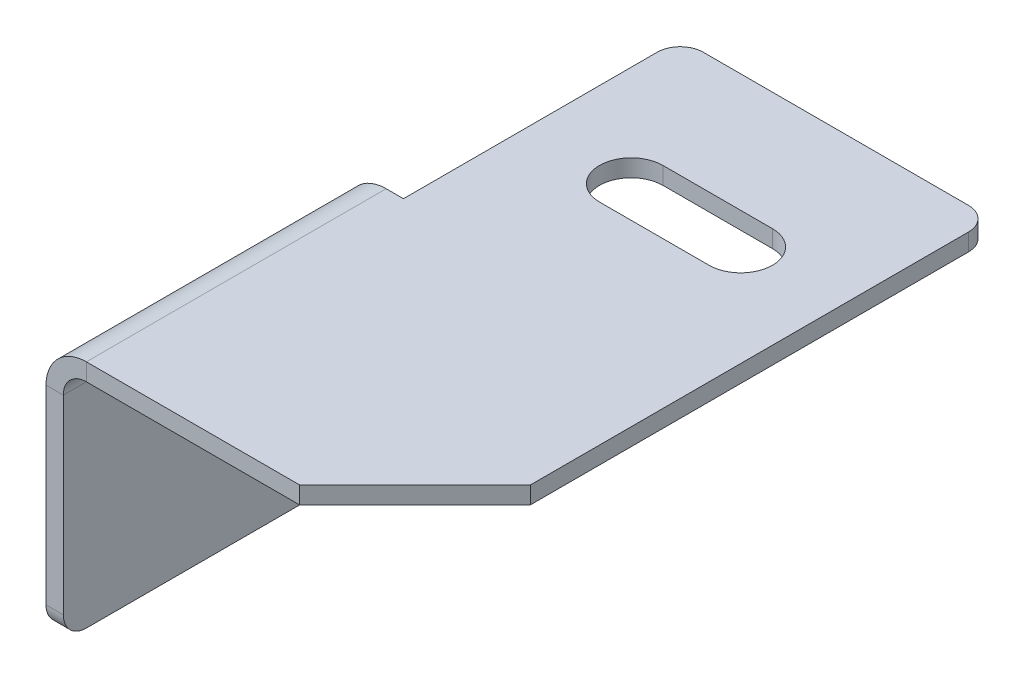
ISO-10303-21;
HEADER;
FILE_DESCRIPTION(('STEP AP214'),'2;1');
FILE_NAME('part.step','',(''),(''),'','','');
FILE_SCHEMA(('AUTOMOTIVE_DESIGN { 1 0 10303 214 1 1 1 1 }'));
ENDSEC;
DATA;
#1=APPLICATION_CONTEXT('core data for automotive mechanical design processes');
#2=APPLICATION_PROTOCOL_DEFINITION('international standard','automotive_design',2000,#1);
#3=PRODUCT_CONTEXT('',#1,'mechanical');
#4=PRODUCT('Part','Part','',(#3));
#5=PRODUCT_RELATED_PRODUCT_CATEGORY('part','',(#4));
#6=PRODUCT_DEFINITION_FORMATION('','',#4);
#7=PRODUCT_DEFINITION_CONTEXT('part definition',#1,'design');
#8=PRODUCT_DEFINITION('design','',#6,#7);
#9=PRODUCT_DEFINITION_SHAPE('','',#8);
#10=(LENGTH_UNIT() NAMED_UNIT(*) SI_UNIT(.MILLI.,.METRE.));
#11=(NAMED_UNIT(*) PLANE_ANGLE_UNIT() SI_UNIT($,.RADIAN.));
#12=(NAMED_UNIT(*) SI_UNIT($,.STERADIAN.) SOLID_ANGLE_UNIT());
#13=UNCERTAINTY_MEASURE_WITH_UNIT(LENGTH_MEASURE(1.E-05),#10,'distance_accuracy_value','');
#14=(GEOMETRIC_REPRESENTATION_CONTEXT(3) GLOBAL_UNCERTAINTY_ASSIGNED_CONTEXT((#13)) GLOBAL_UNIT_ASSIGNED_CONTEXT((#10,
#11,#12)) REPRESENTATION_CONTEXT('',''));
#15=CARTESIAN_POINT('',(0.,0.,0.));
#16=DIRECTION('',(0.,0.,1.));
#17=DIRECTION('',(1.,0.,0.));
#18=AXIS2_PLACEMENT_3D('',#15,#16,#17);
#19=CARTESIAN_POINT('',(5.,-22.,-1.));
#20=DIRECTION('',(0.,0.,1.));
#21=DIRECTION('',(1.,0.,0.));
#22=AXIS2_PLACEMENT_3D('',#19,#20,#21);
#23=PLANE('',#22);
#24=DIRECTION('',(1.,0.,0.));
#25=VECTOR('',#24,1.);
#26=CARTESIAN_POINT('',(0.,-1.5,-1.));
#27=LINE('',#26,#25);
#28=CARTESIAN_POINT('',(3.5,-1.5,-1.));
#29=VERTEX_POINT('',#28);
#30=CARTESIAN_POINT('',(5.,-1.5,-1.));
#31=VERTEX_POINT('',#30);
#32=EDGE_CURVE('E290',#29,#31,#27,.T.);
#33=ORIENTED_EDGE('',*,*,#32,.F.);
#34=DIRECTION('',(0.,1.,0.));
#35=VECTOR('',#34,1.);
#36=CARTESIAN_POINT('',(3.5,-1.5,-1.));
#37=LINE('',#36,#35);
#38=CARTESIAN_POINT('',(3.5,0.,-1.));
#39=VERTEX_POINT('',#38);
#40=EDGE_CURVE('E349',#29,#39,#37,.T.);
#41=ORIENTED_EDGE('',*,*,#40,.T.);
#42=DIRECTION('',(-1.,0.,0.));
#43=VECTOR('',#42,1.);
#44=CARTESIAN_POINT('',(5.,0.,-1.));
#45=LINE('',#44,#43);
#46=CARTESIAN_POINT('',(5.,0.,-1.));
#47=VERTEX_POINT('',#46);
#48=EDGE_CURVE('E281',#47,#39,#45,.T.);
#49=ORIENTED_EDGE('',*,*,#48,.F.);
#50=DIRECTION('',(0.,1.,0.));
#51=VECTOR('',#50,1.);
#52=CARTESIAN_POINT('',(5.,-22.,-1.));
#53=LINE('',#52,#51);
#54=EDGE_CURVE('E276',#31,#47,#53,.T.);
#55=ORIENTED_EDGE('',*,*,#54,.F.);
#56=EDGE_LOOP('',(#33,#41,#49,#55));
#57=FACE_BOUND('',#56,.T.);
#58=ADVANCED_FACE('F110',(#57),#23,.F.);
#59=DIRECTION('',(0.,1.,0.));
#60=VECTOR('',#59,1.);
#61=CARTESIAN_POINT('',(1.5,0.,-1.));
#62=LINE('',#61,#60);
#63=CARTESIAN_POINT('',(1.5,-20.,-1.));
#64=VERTEX_POINT('',#63);
#65=CARTESIAN_POINT('',(1.5,-3.5,-1.));
#66=VERTEX_POINT('',#65);
#67=EDGE_CURVE('E288',#64,#66,#62,.T.);
#68=ORIENTED_EDGE('',*,*,#67,.F.);
#69=DIRECTION('',(-1.,0.,0.));
#70=VECTOR('',#69,1.);
#71=CARTESIAN_POINT('',(0.,-20.,-1.));
#72=LINE('',#71,#70);
#73=CARTESIAN_POINT('',(0.,-20.,-1.));
#74=VERTEX_POINT('',#73);
#75=EDGE_CURVE('E371',#64,#74,#72,.T.);
#76=ORIENTED_EDGE('',*,*,#75,.T.);
#77=DIRECTION('',(0.,1.,0.));
#78=VECTOR('',#77,1.);
#79=CARTESIAN_POINT('',(0.,-22.,-1.));
#80=LINE('',#79,#78);
#81=CARTESIAN_POINT('',(0.,-3.5,-1.));
#82=VERTEX_POINT('',#81);
#83=EDGE_CURVE('E275',#74,#82,#80,.T.);
#84=ORIENTED_EDGE('',*,*,#83,.T.);
#85=DIRECTION('',(1.,0.,0.));
#86=VECTOR('',#85,1.);
#87=CARTESIAN_POINT('',(0.,-3.5,-1.));
#88=LINE('',#87,#86);
#89=EDGE_CURVE('E346',#82,#66,#88,.T.);
#90=ORIENTED_EDGE('',*,*,#89,.T.);
#91=EDGE_LOOP('',(#68,#76,#84,#90));
#92=FACE_BOUND('',#91,.T.);
#93=ADVANCED_FACE('F449',(#92),#23,.F.);
#94=CARTESIAN_POINT('',(3.5,0.,25.));
#95=DIRECTION('',(0.,0.,1.));
#96=DIRECTION('',(1.,0.,0.));
#97=AXIS2_PLACEMENT_3D('',#94,#95,#96);
#98=PLANE('',#97);
#99=DIRECTION('',(0.,-1.,0.));
#100=VECTOR('',#99,1.);
#101=CARTESIAN_POINT('',(3.5,0.,25.));
#102=LINE('',#101,#100);
#103=CARTESIAN_POINT('',(3.5,0.,25.));
#104=VERTEX_POINT('',#103);
#105=CARTESIAN_POINT('',(3.5,-1.5,25.));
#106=VERTEX_POINT('',#105);
#107=EDGE_CURVE('E341',#104,#106,#102,.T.);
#108=ORIENTED_EDGE('',*,*,#107,.F.);
#109=CARTESIAN_POINT('',(3.5,-3.5,25.));
#110=DIRECTION('',(0.,0.,1.));
#111=DIRECTION('',(1.,0.,0.));
#112=AXIS2_PLACEMENT_3D('',#109,#110,#111);
#113=CIRCLE('',#112,3.5);
#114=CARTESIAN_POINT('',(0.,-3.5,25.));
#115=VERTEX_POINT('',#114);
#116=EDGE_CURVE('E302',#115,#104,#113,.F.);
#117=ORIENTED_EDGE('',*,*,#116,.F.);
#118=DIRECTION('',(-1.,0.,0.));
#119=VECTOR('',#118,1.);
#120=CARTESIAN_POINT('',(1.5,-3.5,25.));
#121=LINE('',#120,#119);
#122=CARTESIAN_POINT('',(1.5,-3.5,25.));
#123=VERTEX_POINT('',#122);
#124=EDGE_CURVE('E338',#123,#115,#121,.T.);
#125=ORIENTED_EDGE('',*,*,#124,.F.);
#126=CARTESIAN_POINT('',(3.5,-3.5,25.));
#127=DIRECTION('',(0.,0.,1.));
#128=DIRECTION('',(1.,0.,0.));
#129=AXIS2_PLACEMENT_3D('',#126,#127,#128);
#130=CIRCLE('',#129,2.);
#131=EDGE_CURVE('E309',#123,#106,#130,.F.);
#132=ORIENTED_EDGE('',*,*,#131,.T.);
#133=EDGE_LOOP('',(#108,#117,#125,#132));
#134=FACE_BOUND('',#133,.T.);
#135=ADVANCED_FACE('F436',(#134),#98,.T.);
#136=CARTESIAN_POINT('',(1.5,-3.5,25.));
#137=DIRECTION('',(0.,0.,1.));
#138=DIRECTION('',(1.,0.,0.));
#139=AXIS2_PLACEMENT_3D('',#136,#137,#138);
#140=PLANE('',#139);
#141=DIRECTION('',(1.,0.,0.));
#142=VECTOR('',#141,1.);
#143=CARTESIAN_POINT('',(0.,-1.5,25.));
#144=LINE('',#143,#142);
#145=CARTESIAN_POINT('',(22.,-1.5,25.));
#146=VERTEX_POINT('',#145);
#147=EDGE_CURVE('E297',#106,#146,#144,.T.);
#148=ORIENTED_EDGE('',*,*,#147,.T.);
#149=DIRECTION('',(0.,1.,0.));
#150=VECTOR('',#149,1.);
#151=CARTESIAN_POINT('',(22.,-3.5,25.));
#152=LINE('',#151,#150);
#153=CARTESIAN_POINT('',(22.,0.,25.));
#154=VERTEX_POINT('',#153);
#155=EDGE_CURVE('E118',#146,#154,#152,.T.);
#156=ORIENTED_EDGE('',*,*,#155,.T.);
#157=DIRECTION('',(1.,0.,0.));
#158=VECTOR('',#157,1.);
#159=CARTESIAN_POINT('',(0.,0.,25.));
#160=LINE('',#159,#158);
#161=EDGE_CURVE('E299',#104,#154,#160,.T.);
#162=ORIENTED_EDGE('',*,*,#161,.F.);
#163=ORIENTED_EDGE('',*,*,#107,.T.);
#164=EDGE_LOOP('',(#148,#156,#162,#163));
#165=FACE_BOUND('',#164,.T.);
#166=ADVANCED_FACE('F440',(#165),#140,.T.);
#167=CARTESIAN_POINT('',(0.,-1.5,25.));
#168=DIRECTION('',(0.,1.,0.));
#169=DIRECTION('',(0.,0.,1.));
#170=AXIS2_PLACEMENT_3D('',#167,#168,#169);
#171=PLANE('',#170);
#172=DIRECTION('',(1.,0.,0.));
#173=VECTOR('',#172,1.);
#174=CARTESIAN_POINT('',(13.75,-1.5,-14.75));
#175=LINE('',#174,#173);
#176=CARTESIAN_POINT('',(13.75,-1.5,-14.75));
#177=VERTEX_POINT('',#176);
#178=CARTESIAN_POINT('',(23.25,-1.5,-14.75));
#179=VERTEX_POINT('',#178);
#180=EDGE_CURVE('E252',#177,#179,#175,.T.);
#181=ORIENTED_EDGE('',*,*,#180,.F.);
#182=CARTESIAN_POINT('',(13.75,-1.5,-12.));
#183=DIRECTION('',(0.,-1.,0.));
#184=DIRECTION('',(0.,0.,-1.));
#185=AXIS2_PLACEMENT_3D('',#182,#183,#184);
#186=CIRCLE('',#185,2.75);
#187=CARTESIAN_POINT('',(13.75,-1.5,-9.25000000000001));
#188=VERTEX_POINT('',#187);
#189=EDGE_CURVE('E251',#188,#177,#186,.T.);
#190=ORIENTED_EDGE('',*,*,#189,.F.);
#191=DIRECTION('',(1.,0.,0.));
#192=VECTOR('',#191,1.);
#193=CARTESIAN_POINT('',(13.75,-1.5,-9.25000000000001));
#194=LINE('',#193,#192);
#195=CARTESIAN_POINT('',(23.25,-1.5,-9.25));
#196=VERTEX_POINT('',#195);
#197=EDGE_CURVE('E241',#188,#196,#194,.T.);
#198=ORIENTED_EDGE('',*,*,#197,.T.);
#199=CARTESIAN_POINT('',(23.25,-1.5,-12.));
#200=DIRECTION('',(0.,-1.,0.));
#201=DIRECTION('',(0.,0.,-1.));
#202=AXIS2_PLACEMENT_3D('',#199,#200,#201);
#203=CIRCLE('',#202,2.75);
#204=EDGE_CURVE('E262',#179,#196,#203,.T.);
#205=ORIENTED_EDGE('',*,*,#204,.F.);
#206=EDGE_LOOP('',(#181,#190,#198,#205));
#207=FACE_BOUND('',#206,.T.);
#208=DIRECTION('',(0.,0.,-1.));
#209=VECTOR('',#208,1.);
#210=CARTESIAN_POINT('',(32.,-1.5,25.));
#211=LINE('',#210,#209);
#212=CARTESIAN_POINT('',(32.,-1.5,15.));
#213=VERTEX_POINT('',#212);
#214=CARTESIAN_POINT('',(32.,-1.5,-23.));
#215=VERTEX_POINT('',#214);
#216=EDGE_CURVE('E336',#213,#215,#211,.T.);
#217=ORIENTED_EDGE('',*,*,#216,.F.);
#218=DIRECTION('',(0.707106781186549,0.,-0.707106781186546));
#219=VECTOR('',#218,1.);
#220=CARTESIAN_POINT('',(32.,-1.5,15.));
#221=LINE('',#220,#219);
#222=EDGE_CURVE('E132',#213,#146,#221,.F.);
#223=ORIENTED_EDGE('',*,*,#222,.T.);
#224=ORIENTED_EDGE('',*,*,#147,.F.);
#225=DIRECTION('',(0.,0.,-1.));
#226=VECTOR('',#225,1.);
#227=CARTESIAN_POINT('',(3.5,-1.5,25.));
#228=LINE('',#227,#226);
#229=EDGE_CURVE('E312',#106,#29,#228,.T.);
#230=ORIENTED_EDGE('',*,*,#229,.T.);
#231=ORIENTED_EDGE('',*,*,#32,.T.);
#232=DIRECTION('',(0.,0.,-1.));
#233=VECTOR('',#232,1.);
#234=CARTESIAN_POINT('',(5.,-1.5,25.));
#235=LINE('',#234,#233);
#236=CARTESIAN_POINT('',(5.,-1.5,-23.));
#237=VERTEX_POINT('',#236);
#238=EDGE_CURVE('E285',#31,#237,#235,.T.);
#239=ORIENTED_EDGE('',*,*,#238,.T.);
#240=CARTESIAN_POINT('',(7.,-1.5,-23.));
#241=DIRECTION('',(0.,1.,0.));
#242=DIRECTION('',(0.,0.,1.));
#243=AXIS2_PLACEMENT_3D('',#240,#241,#242);
#244=CIRCLE('',#243,2.);
#245=CARTESIAN_POINT('',(7.,-1.5,-25.));
#246=VERTEX_POINT('',#245);
#247=EDGE_CURVE('E356',#237,#246,#244,.F.);
#248=ORIENTED_EDGE('',*,*,#247,.T.);
#249=DIRECTION('',(1.,0.,0.));
#250=VECTOR('',#249,1.);
#251=CARTESIAN_POINT('',(0.,-1.5,-25.));
#252=LINE('',#251,#250);
#253=CARTESIAN_POINT('',(30.,-1.5,-25.));
#254=VERTEX_POINT('',#253);
#255=EDGE_CURVE('E296',#246,#254,#252,.T.);
#256=ORIENTED_EDGE('',*,*,#255,.T.);
#257=CARTESIAN_POINT('',(30.,-1.5,-23.));
#258=DIRECTION('',(0.,1.,0.));
#259=DIRECTION('',(0.,0.,1.));
#260=AXIS2_PLACEMENT_3D('',#257,#258,#259);
#261=CIRCLE('',#260,2.);
#262=EDGE_CURVE('E358',#254,#215,#261,.F.);
#263=ORIENTED_EDGE('',*,*,#262,.T.);
#264=EDGE_LOOP('',(#217,#223,#224,#230,#231,#239,#248,#256,#263));
#265=FACE_BOUND('',#264,.T.);
#266=ADVANCED_FACE('F265',(#207,#265),#171,.F.);
#267=CARTESIAN_POINT('',(32.,0.,25.));
#268=DIRECTION('',(1.,0.,0.));
#269=DIRECTION('',(0.,0.,-1.));
#270=AXIS2_PLACEMENT_3D('',#267,#268,#269);
#271=PLANE('',#270);
#272=DIRECTION('',(0.,0.,-1.));
#273=VECTOR('',#272,1.);
#274=CARTESIAN_POINT('',(32.,0.,25.));
#275=LINE('',#274,#273);
#276=CARTESIAN_POINT('',(32.,0.,15.));
#277=VERTEX_POINT('',#276);
#278=CARTESIAN_POINT('',(32.,0.,-23.));
#279=VERTEX_POINT('',#278);
#280=EDGE_CURVE('E334',#277,#279,#275,.T.);
#281=ORIENTED_EDGE('',*,*,#280,.F.);
#282=DIRECTION('',(0.,-1.,0.));
#283=VECTOR('',#282,1.);
#284=CARTESIAN_POINT('',(32.,0.,15.));
#285=LINE('',#284,#283);
#286=EDGE_CURVE('E396',#277,#213,#285,.T.);
#287=ORIENTED_EDGE('',*,*,#286,.T.);
#288=ORIENTED_EDGE('',*,*,#216,.T.);
#289=DIRECTION('',(0.,-1.,0.));
#290=VECTOR('',#289,1.);
#291=CARTESIAN_POINT('',(32.,0.,-23.));
#292=LINE('',#291,#290);
#293=EDGE_CURVE('E361',#215,#279,#292,.F.);
#294=ORIENTED_EDGE('',*,*,#293,.T.);
#295=EDGE_LOOP('',(#281,#287,#288,#294));
#296=FACE_BOUND('',#295,.T.);
#297=ADVANCED_FACE('F402',(#296),#271,.T.);
#298=CARTESIAN_POINT('',(0.,0.,25.));
#299=DIRECTION('',(0.,1.,0.));
#300=DIRECTION('',(0.,0.,1.));
#301=AXIS2_PLACEMENT_3D('',#298,#299,#300);
#302=PLANE('',#301);
#303=CARTESIAN_POINT('',(13.75,0.,-12.));
#304=DIRECTION('',(0.,1.,0.));
#305=DIRECTION('',(0.,0.,1.));
#306=AXIS2_PLACEMENT_3D('',#303,#304,#305);
#307=CIRCLE('',#306,2.75);
#308=CARTESIAN_POINT('',(13.75,0.,-14.75));
#309=VERTEX_POINT('',#308);
#310=CARTESIAN_POINT('',(13.75,0.,-9.25));
#311=VERTEX_POINT('',#310);
#312=EDGE_CURVE('E260',#309,#311,#307,.T.);
#313=ORIENTED_EDGE('',*,*,#312,.F.);
#314=DIRECTION('',(-1.,0.,0.));
#315=VECTOR('',#314,1.);
#316=CARTESIAN_POINT('',(0.,0.,-14.75));
#317=LINE('',#316,#315);
#318=CARTESIAN_POINT('',(23.25,0.,-14.75));
#319=VERTEX_POINT('',#318);
#320=EDGE_CURVE('E393',#319,#309,#317,.T.);
#321=ORIENTED_EDGE('',*,*,#320,.F.);
#322=CARTESIAN_POINT('',(23.25,0.,-12.));
#323=DIRECTION('',(0.,1.,0.));
#324=DIRECTION('',(0.,0.,1.));
#325=AXIS2_PLACEMENT_3D('',#322,#323,#324);
#326=CIRCLE('',#325,2.75);
#327=CARTESIAN_POINT('',(23.25,0.,-9.25000000000001));
#328=VERTEX_POINT('',#327);
#329=EDGE_CURVE('E391',#328,#319,#326,.T.);
#330=ORIENTED_EDGE('',*,*,#329,.F.);
#331=DIRECTION('',(1.,0.,0.));
#332=VECTOR('',#331,1.);
#333=CARTESIAN_POINT('',(0.,0.,-9.25));
#334=LINE('',#333,#332);
#335=EDGE_CURVE('E389',#311,#328,#334,.T.);
#336=ORIENTED_EDGE('',*,*,#335,.F.);
#337=EDGE_LOOP('',(#313,#321,#330,#336));
#338=FACE_BOUND('',#337,.T.);
#339=ORIENTED_EDGE('',*,*,#161,.T.);
#340=DIRECTION('',(-0.707106781186549,0.,0.707106781186546));
#341=VECTOR('',#340,1.);
#342=CARTESIAN_POINT('',(10.9999999999999,0.,36.));
#343=LINE('',#342,#341);
#344=EDGE_CURVE('E13',#154,#277,#343,.F.);
#345=ORIENTED_EDGE('',*,*,#344,.T.);
#346=ORIENTED_EDGE('',*,*,#280,.T.);
#347=CARTESIAN_POINT('',(30.,0.,-23.));
#348=DIRECTION('',(0.,1.,0.));
#349=DIRECTION('',(0.,0.,1.));
#350=AXIS2_PLACEMENT_3D('',#347,#348,#349);
#351=CIRCLE('',#350,2.);
#352=CARTESIAN_POINT('',(30.,0.,-25.));
#353=VERTEX_POINT('',#352);
#354=EDGE_CURVE('E366',#279,#353,#351,.T.);
#355=ORIENTED_EDGE('',*,*,#354,.T.);
#356=DIRECTION('',(1.,0.,0.));
#357=VECTOR('',#356,1.);
#358=CARTESIAN_POINT('',(0.,0.,-25.));
#359=LINE('',#358,#357);
#360=CARTESIAN_POINT('',(7.,0.,-25.));
#361=VERTEX_POINT('',#360);
#362=EDGE_CURVE('E300',#361,#353,#359,.T.);
#363=ORIENTED_EDGE('',*,*,#362,.F.);
#364=CARTESIAN_POINT('',(7.,0.,-23.));
#365=DIRECTION('',(0.,1.,0.));
#366=DIRECTION('',(0.,0.,1.));
#367=AXIS2_PLACEMENT_3D('',#364,#365,#366);
#368=CIRCLE('',#367,2.);
#369=CARTESIAN_POINT('',(5.,0.,-23.));
#370=VERTEX_POINT('',#369);
#371=EDGE_CURVE('E364',#361,#370,#368,.T.);
#372=ORIENTED_EDGE('',*,*,#371,.T.);
#373=DIRECTION('',(0.,0.,-1.));
#374=VECTOR('',#373,1.);
#375=CARTESIAN_POINT('',(5.,0.,-25.));
#376=LINE('',#375,#374);
#377=EDGE_CURVE('E278',#47,#370,#376,.T.);
#378=ORIENTED_EDGE('',*,*,#377,.F.);
#379=ORIENTED_EDGE('',*,*,#48,.T.);
#380=DIRECTION('',(0.,0.,-1.));
#381=VECTOR('',#380,1.);
#382=CARTESIAN_POINT('',(3.5,0.,25.));
#383=LINE('',#382,#381);
#384=EDGE_CURVE('E331',#104,#39,#383,.T.);
#385=ORIENTED_EDGE('',*,*,#384,.F.);
#386=EDGE_LOOP('',(#339,#345,#346,#355,#363,#372,#378,#379,#385));
#387=FACE_BOUND('',#386,.T.);
#388=ADVANCED_FACE('F413',(#338,#387),#302,.T.);
#389=CARTESIAN_POINT('',(3.5,-3.5,25.));
#390=DIRECTION('',(0.,0.,-1.));
#391=DIRECTION('',(-1.,0.,0.));
#392=AXIS2_PLACEMENT_3D('',#389,#390,#391);
#393=CYLINDRICAL_SURFACE('',#392,3.5);
#394=CARTESIAN_POINT('',(3.5,-3.5,-1.));
#395=DIRECTION('',(0.,0.,1.));
#396=DIRECTION('',(1.,0.,0.));
#397=AXIS2_PLACEMENT_3D('',#394,#395,#396);
#398=CIRCLE('',#397,3.5);
#399=EDGE_CURVE('E293',#82,#39,#398,.F.);
#400=ORIENTED_EDGE('',*,*,#399,.F.);
#401=DIRECTION('',(0.,0.,-1.));
#402=VECTOR('',#401,1.);
#403=CARTESIAN_POINT('',(0.,-3.5,25.));
#404=LINE('',#403,#402);
#405=EDGE_CURVE('E328',#115,#82,#404,.T.);
#406=ORIENTED_EDGE('',*,*,#405,.F.);
#407=ORIENTED_EDGE('',*,*,#116,.T.);
#408=ORIENTED_EDGE('',*,*,#384,.T.);
#409=EDGE_LOOP('',(#400,#406,#407,#408));
#410=FACE_BOUND('',#409,.T.);
#411=ADVANCED_FACE('F431',(#410),#393,.T.);
#412=CARTESIAN_POINT('',(0.,0.,25.));
#413=DIRECTION('',(-1.,0.,0.));
#414=DIRECTION('',(0.,-1.,0.));
#415=AXIS2_PLACEMENT_3D('',#412,#413,#414);
#416=PLANE('',#415);
#417=ORIENTED_EDGE('',*,*,#83,.F.);
#418=CARTESIAN_POINT('',(0.,-20.,0.999999999999999));
#419=DIRECTION('',(-1.,0.,0.));
#420=DIRECTION('',(0.,-1.,0.));
#421=AXIS2_PLACEMENT_3D('',#418,#419,#420);
#422=CIRCLE('',#421,2.);
#423=CARTESIAN_POINT('',(0.,-22.,1.));
#424=VERTEX_POINT('',#423);
#425=EDGE_CURVE('E376',#74,#424,#422,.T.);
#426=ORIENTED_EDGE('',*,*,#425,.T.);
#427=DIRECTION('',(0.,0.,-1.));
#428=VECTOR('',#427,1.);
#429=CARTESIAN_POINT('',(0.,-22.,25.));
#430=LINE('',#429,#428);
#431=CARTESIAN_POINT('',(0.,-22.,23.));
#432=VERTEX_POINT('',#431);
#433=EDGE_CURVE('E325',#432,#424,#430,.T.);
#434=ORIENTED_EDGE('',*,*,#433,.F.);
#435=CARTESIAN_POINT('',(0.,-20.,23.));
#436=DIRECTION('',(-1.,0.,0.));
#437=DIRECTION('',(0.,-1.,0.));
#438=AXIS2_PLACEMENT_3D('',#435,#436,#437);
#439=CIRCLE('',#438,2.);
#440=CARTESIAN_POINT('',(0.,-20.,25.));
#441=VERTEX_POINT('',#440);
#442=EDGE_CURVE('E374',#432,#441,#439,.T.);
#443=ORIENTED_EDGE('',*,*,#442,.T.);
#444=DIRECTION('',(0.,1.,0.));
#445=VECTOR('',#444,1.);
#446=CARTESIAN_POINT('',(0.,0.,25.));
#447=LINE('',#446,#445);
#448=EDGE_CURVE('E305',#441,#115,#447,.T.);
#449=ORIENTED_EDGE('',*,*,#448,.T.);
#450=ORIENTED_EDGE('',*,*,#405,.T.);
#451=EDGE_LOOP('',(#417,#426,#434,#443,#449,#450));
#452=FACE_BOUND('',#451,.T.);
#453=ADVANCED_FACE('F479',(#452),#416,.T.);
#454=CARTESIAN_POINT('',(1.5,-22.,25.));
#455=DIRECTION('',(0.,-1.,0.));
#456=DIRECTION('',(0.,0.,-1.));
#457=AXIS2_PLACEMENT_3D('',#454,#455,#456);
#458=PLANE('',#457);
#459=ORIENTED_EDGE('',*,*,#433,.T.);
#460=DIRECTION('',(-1.,0.,0.));
#461=VECTOR('',#460,1.);
#462=CARTESIAN_POINT('',(1.5,-22.,0.999999999999999));
#463=LINE('',#462,#461);
#464=CARTESIAN_POINT('',(1.5,-22.,1.));
#465=VERTEX_POINT('',#464);
#466=EDGE_CURVE('E381',#424,#465,#463,.F.);
#467=ORIENTED_EDGE('',*,*,#466,.T.);
#468=DIRECTION('',(0.,0.,-1.));
#469=VECTOR('',#468,1.);
#470=CARTESIAN_POINT('',(1.5,-22.,25.));
#471=LINE('',#470,#469);
#472=CARTESIAN_POINT('',(1.5,-22.,23.));
#473=VERTEX_POINT('',#472);
#474=EDGE_CURVE('E322',#473,#465,#471,.T.);
#475=ORIENTED_EDGE('',*,*,#474,.F.);
#476=DIRECTION('',(-1.,0.,0.));
#477=VECTOR('',#476,1.);
#478=CARTESIAN_POINT('',(1.5,-22.,23.));
#479=LINE('',#478,#477);
#480=EDGE_CURVE('E378',#473,#432,#479,.T.);
#481=ORIENTED_EDGE('',*,*,#480,.T.);
#482=EDGE_LOOP('',(#459,#467,#475,#481));
#483=FACE_BOUND('',#482,.T.);
#484=ADVANCED_FACE('F489',(#483),#458,.T.);
#485=CARTESIAN_POINT('',(1.5,0.,25.));
#486=DIRECTION('',(-1.,0.,0.));
#487=DIRECTION('',(0.,-1.,0.));
#488=AXIS2_PLACEMENT_3D('',#485,#486,#487);
#489=PLANE('',#488);
#490=ORIENTED_EDGE('',*,*,#474,.T.);
#491=CARTESIAN_POINT('',(1.5,-20.,0.999999999999999));
#492=DIRECTION('',(-1.,0.,0.));
#493=DIRECTION('',(0.,-1.,0.));
#494=AXIS2_PLACEMENT_3D('',#491,#492,#493);
#495=CIRCLE('',#494,2.);
#496=EDGE_CURVE('E385',#465,#64,#495,.F.);
#497=ORIENTED_EDGE('',*,*,#496,.T.);
#498=ORIENTED_EDGE('',*,*,#67,.T.);
#499=DIRECTION('',(0.,0.,-1.));
#500=VECTOR('',#499,1.);
#501=CARTESIAN_POINT('',(1.5,-3.5,25.));
#502=LINE('',#501,#500);
#503=EDGE_CURVE('E319',#123,#66,#502,.T.);
#504=ORIENTED_EDGE('',*,*,#503,.F.);
#505=DIRECTION('',(0.,1.,0.));
#506=VECTOR('',#505,1.);
#507=CARTESIAN_POINT('',(1.5,0.,25.));
#508=LINE('',#507,#506);
#509=CARTESIAN_POINT('',(1.5,-20.,25.));
#510=VERTEX_POINT('',#509);
#511=EDGE_CURVE('E307',#510,#123,#508,.T.);
#512=ORIENTED_EDGE('',*,*,#511,.F.);
#513=CARTESIAN_POINT('',(1.5,-20.,23.));
#514=DIRECTION('',(-1.,0.,0.));
#515=DIRECTION('',(0.,-1.,0.));
#516=AXIS2_PLACEMENT_3D('',#513,#514,#515);
#517=CIRCLE('',#516,2.);
#518=EDGE_CURVE('E383',#510,#473,#517,.F.);
#519=ORIENTED_EDGE('',*,*,#518,.T.);
#520=EDGE_LOOP('',(#490,#497,#498,#504,#512,#519));
#521=FACE_BOUND('',#520,.T.);
#522=ADVANCED_FACE('F472',(#521),#489,.F.);
#523=CARTESIAN_POINT('',(3.5,-3.5,25.));
#524=DIRECTION('',(0.,0.,-1.));
#525=DIRECTION('',(-1.,0.,0.));
#526=AXIS2_PLACEMENT_3D('',#523,#524,#525);
#527=CYLINDRICAL_SURFACE('',#526,2.);
#528=ORIENTED_EDGE('',*,*,#503,.T.);
#529=CARTESIAN_POINT('',(3.5,-3.5,-1.));
#530=DIRECTION('',(0.,0.,1.));
#531=DIRECTION('',(1.,0.,0.));
#532=AXIS2_PLACEMENT_3D('',#529,#530,#531);
#533=CIRCLE('',#532,2.);
#534=EDGE_CURVE('E343',#66,#29,#533,.F.);
#535=ORIENTED_EDGE('',*,*,#534,.T.);
#536=ORIENTED_EDGE('',*,*,#229,.F.);
#537=ORIENTED_EDGE('',*,*,#131,.F.);
#538=EDGE_LOOP('',(#528,#535,#536,#537));
#539=FACE_BOUND('',#538,.T.);
#540=ADVANCED_FACE('F469',(#539),#527,.F.);
#541=CARTESIAN_POINT('',(3.5,-3.5,25.));
#542=DIRECTION('',(0.,0.,1.));
#543=DIRECTION('',(1.,0.,0.));
#544=AXIS2_PLACEMENT_3D('',#541,#542,#543);
#545=PLANE('',#544);
#546=ORIENTED_EDGE('',*,*,#448,.F.);
#547=DIRECTION('',(-1.,0.,0.));
#548=VECTOR('',#547,1.);
#549=CARTESIAN_POINT('',(3.5,-20.,25.));
#550=LINE('',#549,#548);
#551=EDGE_CURVE('E387',#441,#510,#550,.F.);
#552=ORIENTED_EDGE('',*,*,#551,.T.);
#553=ORIENTED_EDGE('',*,*,#511,.T.);
#554=ORIENTED_EDGE('',*,*,#124,.T.);
#555=EDGE_LOOP('',(#546,#552,#553,#554));
#556=FACE_BOUND('',#555,.T.);
#557=ADVANCED_FACE('F464',(#556),#545,.T.);
#558=CARTESIAN_POINT('',(3.5,-3.5,-25.));
#559=DIRECTION('',(0.,0.,1.));
#560=DIRECTION('',(1.,0.,0.));
#561=AXIS2_PLACEMENT_3D('',#558,#559,#560);
#562=PLANE('',#561);
#563=ORIENTED_EDGE('',*,*,#362,.T.);
#564=DIRECTION('',(0.,-1.,0.));
#565=VECTOR('',#564,1.);
#566=CARTESIAN_POINT('',(30.,-1.5,-25.));
#567=LINE('',#566,#565);
#568=EDGE_CURVE('E353',#353,#254,#567,.T.);
#569=ORIENTED_EDGE('',*,*,#568,.T.);
#570=ORIENTED_EDGE('',*,*,#255,.F.);
#571=DIRECTION('',(0.,-1.,0.));
#572=VECTOR('',#571,1.);
#573=CARTESIAN_POINT('',(7.,-3.5,-25.));
#574=LINE('',#573,#572);
#575=EDGE_CURVE('E351',#246,#361,#574,.F.);
#576=ORIENTED_EDGE('',*,*,#575,.T.);
#577=EDGE_LOOP('',(#563,#569,#570,#576));
#578=FACE_BOUND('',#577,.T.);
#579=ADVANCED_FACE('F416',(#578),#562,.F.);
#580=ORIENTED_EDGE('',*,*,#40,.F.);
#581=ORIENTED_EDGE('',*,*,#534,.F.);
#582=ORIENTED_EDGE('',*,*,#89,.F.);
#583=ORIENTED_EDGE('',*,*,#399,.T.);
#584=EDGE_LOOP('',(#580,#581,#582,#583));
#585=FACE_BOUND('',#584,.T.);
#586=ADVANCED_FACE('F451',(#585),#23,.F.);
#587=CARTESIAN_POINT('',(5.,0.,0.));
#588=DIRECTION('',(1.,0.,0.));
#589=DIRECTION('',(0.,1.,0.));
#590=AXIS2_PLACEMENT_3D('',#587,#588,#589);
#591=PLANE('',#590);
#592=ORIENTED_EDGE('',*,*,#377,.T.);
#593=DIRECTION('',(0.,-1.,0.));
#594=VECTOR('',#593,1.);
#595=CARTESIAN_POINT('',(5.,0.,-23.));
#596=LINE('',#595,#594);
#597=EDGE_CURVE('E368',#370,#237,#596,.T.);
#598=ORIENTED_EDGE('',*,*,#597,.T.);
#599=ORIENTED_EDGE('',*,*,#238,.F.);
#600=ORIENTED_EDGE('',*,*,#54,.T.);
#601=EDGE_LOOP('',(#592,#598,#599,#600));
#602=FACE_BOUND('',#601,.T.);
#603=ADVANCED_FACE('F423',(#602),#591,.F.);
#604=CARTESIAN_POINT('',(30.,-3.5,-23.));
#605=DIRECTION('',(0.,1.,0.));
#606=DIRECTION('',(0.,0.,1.));
#607=AXIS2_PLACEMENT_3D('',#604,#605,#606);
#608=CYLINDRICAL_SURFACE('',#607,2.);
#609=ORIENTED_EDGE('',*,*,#354,.F.);
#610=ORIENTED_EDGE('',*,*,#293,.F.);
#611=ORIENTED_EDGE('',*,*,#262,.F.);
#612=ORIENTED_EDGE('',*,*,#568,.F.);
#613=EDGE_LOOP('',(#609,#610,#611,#612));
#614=FACE_BOUND('',#613,.T.);
#615=ADVANCED_FACE('F410',(#614),#608,.T.);
#616=CARTESIAN_POINT('',(7.,0.,-23.));
#617=DIRECTION('',(0.,-1.,0.));
#618=DIRECTION('',(1.,0.,0.));
#619=AXIS2_PLACEMENT_3D('',#616,#617,#618);
#620=CYLINDRICAL_SURFACE('',#619,2.);
#621=ORIENTED_EDGE('',*,*,#371,.F.);
#622=ORIENTED_EDGE('',*,*,#575,.F.);
#623=ORIENTED_EDGE('',*,*,#247,.F.);
#624=ORIENTED_EDGE('',*,*,#597,.F.);
#625=EDGE_LOOP('',(#621,#622,#623,#624));
#626=FACE_BOUND('',#625,.T.);
#627=ADVANCED_FACE('F419',(#626),#620,.T.);
#628=CARTESIAN_POINT('',(5.,-20.,0.999999999999999));
#629=DIRECTION('',(1.,0.,0.));
#630=DIRECTION('',(0.,0.,-1.));
#631=AXIS2_PLACEMENT_3D('',#628,#629,#630);
#632=CYLINDRICAL_SURFACE('',#631,2.);
#633=ORIENTED_EDGE('',*,*,#496,.F.);
#634=ORIENTED_EDGE('',*,*,#466,.F.);
#635=ORIENTED_EDGE('',*,*,#425,.F.);
#636=ORIENTED_EDGE('',*,*,#75,.F.);
#637=EDGE_LOOP('',(#633,#634,#635,#636));
#638=FACE_BOUND('',#637,.T.);
#639=ADVANCED_FACE('F492',(#638),#632,.T.);
#640=CARTESIAN_POINT('',(1.5,-20.,23.));
#641=DIRECTION('',(-1.,0.,0.));
#642=DIRECTION('',(0.,0.,1.));
#643=AXIS2_PLACEMENT_3D('',#640,#641,#642);
#644=CYLINDRICAL_SURFACE('',#643,2.);
#645=ORIENTED_EDGE('',*,*,#518,.F.);
#646=ORIENTED_EDGE('',*,*,#551,.F.);
#647=ORIENTED_EDGE('',*,*,#442,.F.);
#648=ORIENTED_EDGE('',*,*,#480,.F.);
#649=EDGE_LOOP('',(#645,#646,#647,#648));
#650=FACE_BOUND('',#649,.T.);
#651=ADVANCED_FACE('F485',(#650),#644,.T.);
#652=CARTESIAN_POINT('',(23.25,-1.5,-12.));
#653=DIRECTION('',(0.,-1.,0.));
#654=DIRECTION('',(0.,0.,-1.));
#655=AXIS2_PLACEMENT_3D('',#652,#653,#654);
#656=CYLINDRICAL_SURFACE('',#655,2.75);
#657=ORIENTED_EDGE('',*,*,#329,.T.);
#658=DIRECTION('',(0.,-1.,0.));
#659=VECTOR('',#658,1.);
#660=CARTESIAN_POINT('',(23.25,-1.5,-14.75));
#661=LINE('',#660,#659);
#662=EDGE_CURVE('E272',#179,#319,#661,.F.);
#663=ORIENTED_EDGE('',*,*,#662,.F.);
#664=ORIENTED_EDGE('',*,*,#204,.T.);
#665=DIRECTION('',(0.,-1.,0.));
#666=VECTOR('',#665,1.);
#667=CARTESIAN_POINT('',(23.25,-1.5,-9.25000000000001));
#668=LINE('',#667,#666);
#669=EDGE_CURVE('E247',#328,#196,#668,.T.);
#670=ORIENTED_EDGE('',*,*,#669,.F.);
#671=EDGE_LOOP('',(#657,#663,#664,#670));
#672=FACE_BOUND('',#671,.T.);
#673=ADVANCED_FACE('F499',(#672),#656,.F.);
#674=CARTESIAN_POINT('',(13.75,-1.5,-12.));
#675=DIRECTION('',(0.,-1.,0.));
#676=DIRECTION('',(0.,0.,-1.));
#677=AXIS2_PLACEMENT_3D('',#674,#675,#676);
#678=CYLINDRICAL_SURFACE('',#677,2.75);
#679=ORIENTED_EDGE('',*,*,#312,.T.);
#680=DIRECTION('',(0.,-1.,0.));
#681=VECTOR('',#680,1.);
#682=CARTESIAN_POINT('',(13.75,-1.5,-9.25000000000001));
#683=LINE('',#682,#681);
#684=EDGE_CURVE('E244',#188,#311,#683,.F.);
#685=ORIENTED_EDGE('',*,*,#684,.F.);
#686=ORIENTED_EDGE('',*,*,#189,.T.);
#687=DIRECTION('',(0.,-1.,0.));
#688=VECTOR('',#687,1.);
#689=CARTESIAN_POINT('',(13.75,-1.5,-14.75));
#690=LINE('',#689,#688);
#691=EDGE_CURVE('E263',#309,#177,#690,.T.);
#692=ORIENTED_EDGE('',*,*,#691,.F.);
#693=EDGE_LOOP('',(#679,#685,#686,#692));
#694=FACE_BOUND('',#693,.T.);
#695=ADVANCED_FACE('F256',(#694),#678,.F.);
#696=CARTESIAN_POINT('',(13.75,-1.5,-9.25000000000001));
#697=DIRECTION('',(0.,0.,1.));
#698=DIRECTION('',(1.,0.,0.));
#699=AXIS2_PLACEMENT_3D('',#696,#697,#698);
#700=PLANE('',#699);
#701=ORIENTED_EDGE('',*,*,#335,.T.);
#702=ORIENTED_EDGE('',*,*,#669,.T.);
#703=ORIENTED_EDGE('',*,*,#197,.F.);
#704=ORIENTED_EDGE('',*,*,#684,.T.);
#705=EDGE_LOOP('',(#701,#702,#703,#704));
#706=FACE_BOUND('',#705,.T.);
#707=ADVANCED_FACE('F243',(#706),#700,.F.);
#708=CARTESIAN_POINT('',(13.75,-1.5,-14.75));
#709=DIRECTION('',(0.,0.,-1.));
#710=DIRECTION('',(-1.,0.,0.));
#711=AXIS2_PLACEMENT_3D('',#708,#709,#710);
#712=PLANE('',#711);
#713=ORIENTED_EDGE('',*,*,#320,.T.);
#714=ORIENTED_EDGE('',*,*,#691,.T.);
#715=ORIENTED_EDGE('',*,*,#180,.T.);
#716=ORIENTED_EDGE('',*,*,#662,.T.);
#717=EDGE_LOOP('',(#713,#714,#715,#716));
#718=FACE_BOUND('',#717,.T.);
#719=ADVANCED_FACE('F442',(#718),#712,.F.);
#720=CARTESIAN_POINT('',(32.,0.,15.));
#721=DIRECTION('',(-0.707106781186546,0.,-0.707106781186549));
#722=DIRECTION('',(0.,-1.,0.));
#723=AXIS2_PLACEMENT_3D('',#720,#721,#722);
#724=PLANE('',#723);
#725=ORIENTED_EDGE('',*,*,#344,.F.);
#726=ORIENTED_EDGE('',*,*,#155,.F.);
#727=ORIENTED_EDGE('',*,*,#222,.F.);
#728=ORIENTED_EDGE('',*,*,#286,.F.);
#729=EDGE_LOOP('',(#725,#726,#727,#728));
#730=FACE_BOUND('',#729,.T.);
#731=ADVANCED_FACE('F112',(#730),#724,.F.);
#732=CLOSED_SHELL('',(#58,#93,#135,#166,#266,#297,#388,#411,#453,#484,#522,#540,#557,#579,#586,
#603,#615,#627,#639,#651,#673,#695,#707,#719,#731));
#733=MANIFOLD_SOLID_BREP('B2',#732);
#734=ADVANCED_BREP_SHAPE_REPRESENTATION('',(#18,#733),#14);
#735=SHAPE_DEFINITION_REPRESENTATION(#9,#734);
ENDSEC;
END-ISO-10303-21;
